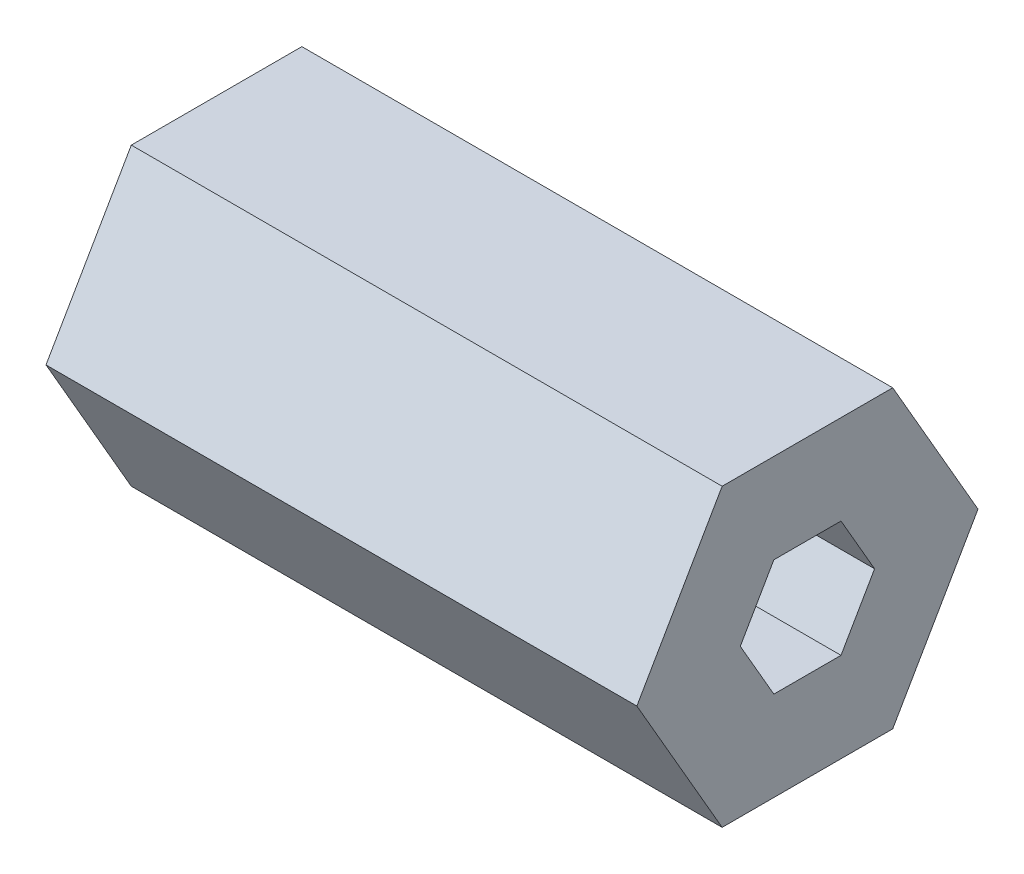
ISO-10303-21;
HEADER;
FILE_DESCRIPTION(('STEP AP214'),'2;1');
FILE_NAME('part.step','',(''),(''),'','','');
FILE_SCHEMA(('AUTOMOTIVE_DESIGN { 1 0 10303 214 1 1 1 1 }'));
ENDSEC;
DATA;
#1=APPLICATION_CONTEXT('core data for automotive mechanical design processes');
#2=APPLICATION_PROTOCOL_DEFINITION('international standard','automotive_design',2000,#1);
#3=PRODUCT_CONTEXT('',#1,'mechanical');
#4=PRODUCT('Part','Part','',(#3));
#5=PRODUCT_RELATED_PRODUCT_CATEGORY('part','',(#4));
#6=PRODUCT_DEFINITION_FORMATION('','',#4);
#7=PRODUCT_DEFINITION_CONTEXT('part definition',#1,'design');
#8=PRODUCT_DEFINITION('design','',#6,#7);
#9=PRODUCT_DEFINITION_SHAPE('','',#8);
#10=(LENGTH_UNIT() NAMED_UNIT(*) SI_UNIT(.MILLI.,.METRE.));
#11=(NAMED_UNIT(*) PLANE_ANGLE_UNIT() SI_UNIT($,.RADIAN.));
#12=(NAMED_UNIT(*) SI_UNIT($,.STERADIAN.) SOLID_ANGLE_UNIT());
#13=UNCERTAINTY_MEASURE_WITH_UNIT(LENGTH_MEASURE(1.E-05),#10,'distance_accuracy_value','');
#14=(GEOMETRIC_REPRESENTATION_CONTEXT(3) GLOBAL_UNCERTAINTY_ASSIGNED_CONTEXT((#13)) GLOBAL_UNIT_ASSIGNED_CONTEXT((#10,
#11,#12)) REPRESENTATION_CONTEXT('',''));
#15=CARTESIAN_POINT('',(0.,0.,0.));
#16=DIRECTION('',(0.,0.,1.));
#17=DIRECTION('',(1.,0.,0.));
#18=AXIS2_PLACEMENT_3D('',#15,#16,#17);
#19=CARTESIAN_POINT('',(12.7,0.,0.));
#20=DIRECTION('',(1.,0.,0.));
#21=DIRECTION('',(0.,0.,-1.));
#22=AXIS2_PLACEMENT_3D('',#19,#20,#21);
#23=PLANE('',#22);
#24=DIRECTION('',(0.,0.866025403784441,-0.499999999999995));
#25=VECTOR('',#24,1.);
#26=CARTESIAN_POINT('',(12.7,-6.34999999999996,-3.6661742093542));
#27=LINE('',#26,#25);
#28=CARTESIAN_POINT('',(12.7,-6.34999999999996,-3.6661742093542));
#29=VERTEX_POINT('',#28);
#30=CARTESIAN_POINT('',(12.7,0.,-7.33234841870825));
#31=VERTEX_POINT('',#30);
#32=EDGE_CURVE('E181',#29,#31,#27,.T.);
#33=ORIENTED_EDGE('',*,*,#32,.T.);
#34=DIRECTION('',(0.,0.866025403784438,0.500000000000001));
#35=VECTOR('',#34,1.);
#36=CARTESIAN_POINT('',(12.7,0.,-7.33234841870825));
#37=LINE('',#36,#35);
#38=CARTESIAN_POINT('',(12.7,6.35000000000001,-3.66617420935411));
#39=VERTEX_POINT('',#38);
#40=EDGE_CURVE('E184',#31,#39,#37,.T.);
#41=ORIENTED_EDGE('',*,*,#40,.T.);
#42=DIRECTION('',(0.,0.,1.));
#43=VECTOR('',#42,1.);
#44=CARTESIAN_POINT('',(12.7,6.35000000000001,-3.66617420935411));
#45=LINE('',#44,#43);
#46=CARTESIAN_POINT('',(12.7,6.34999999999999,3.66617420935416));
#47=VERTEX_POINT('',#46);
#48=EDGE_CURVE('E187',#39,#47,#45,.T.);
#49=ORIENTED_EDGE('',*,*,#48,.T.);
#50=DIRECTION('',(0.,-0.866025403784442,0.499999999999995));
#51=VECTOR('',#50,1.);
#52=CARTESIAN_POINT('',(12.7,6.34999999999999,3.66617420935416));
#53=LINE('',#52,#51);
#54=CARTESIAN_POINT('',(12.7,0.,7.33234841870825));
#55=VERTEX_POINT('',#54);
#56=EDGE_CURVE('E189',#47,#55,#53,.T.);
#57=ORIENTED_EDGE('',*,*,#56,.T.);
#58=DIRECTION('',(0.,-0.866025403784435,-0.500000000000007));
#59=VECTOR('',#58,1.);
#60=CARTESIAN_POINT('',(12.7,0.,7.33234841870825));
#61=LINE('',#60,#59);
#62=CARTESIAN_POINT('',(12.7,-6.35000000000004,3.66617420935407));
#63=VERTEX_POINT('',#62);
#64=EDGE_CURVE('E191',#55,#63,#61,.T.);
#65=ORIENTED_EDGE('',*,*,#64,.T.);
#66=DIRECTION('',(0.,0.,-1.));
#67=VECTOR('',#66,1.);
#68=CARTESIAN_POINT('',(12.7,-6.35000000000004,3.66617420935407));
#69=LINE('',#68,#67);
#70=EDGE_CURVE('E193',#63,#29,#69,.T.);
#71=ORIENTED_EDGE('',*,*,#70,.T.);
#72=EDGE_LOOP('',(#33,#41,#49,#57,#65,#71));
#73=FACE_BOUND('',#72,.T.);
#74=DIRECTION('',(0.,0.866025403784438,0.5));
#75=VECTOR('',#74,1.);
#76=CARTESIAN_POINT('',(12.7,0.,-2.88675134594813));
#77=LINE('',#76,#75);
#78=CARTESIAN_POINT('',(12.7,0.,-2.88675134594813));
#79=VERTEX_POINT('',#78);
#80=CARTESIAN_POINT('',(12.7,2.5,-1.44337567297406));
#81=VERTEX_POINT('',#80);
#82=EDGE_CURVE('E138',#79,#81,#77,.T.);
#83=ORIENTED_EDGE('',*,*,#82,.F.);
#84=DIRECTION('',(0.,0.866025403784439,-0.5));
#85=VECTOR('',#84,1.);
#86=CARTESIAN_POINT('',(12.7,-2.5,-1.44337567297407));
#87=LINE('',#86,#85);
#88=CARTESIAN_POINT('',(12.7,-2.5,-1.44337567297407));
#89=VERTEX_POINT('',#88);
#90=EDGE_CURVE('E130',#89,#79,#87,.T.);
#91=ORIENTED_EDGE('',*,*,#90,.F.);
#92=DIRECTION('',(0.,0.,-1.));
#93=VECTOR('',#92,1.);
#94=CARTESIAN_POINT('',(12.7,-2.5,1.44337567297406));
#95=LINE('',#94,#93);
#96=CARTESIAN_POINT('',(12.7,-2.5,1.44337567297406));
#97=VERTEX_POINT('',#96);
#98=EDGE_CURVE('E159',#97,#89,#95,.T.);
#99=ORIENTED_EDGE('',*,*,#98,.F.);
#100=DIRECTION('',(0.,-0.866025403784438,-0.5));
#101=VECTOR('',#100,1.);
#102=CARTESIAN_POINT('',(12.7,0.,2.88675134594813));
#103=LINE('',#102,#101);
#104=CARTESIAN_POINT('',(12.7,0.,2.88675134594813));
#105=VERTEX_POINT('',#104);
#106=EDGE_CURVE('E157',#105,#97,#103,.T.);
#107=ORIENTED_EDGE('',*,*,#106,.F.);
#108=DIRECTION('',(0.,-0.866025403784439,0.5));
#109=VECTOR('',#108,1.);
#110=CARTESIAN_POINT('',(12.7,2.5,1.44337567297406));
#111=LINE('',#110,#109);
#112=CARTESIAN_POINT('',(12.7,2.5,1.44337567297406));
#113=VERTEX_POINT('',#112);
#114=EDGE_CURVE('E153',#113,#105,#111,.T.);
#115=ORIENTED_EDGE('',*,*,#114,.F.);
#116=DIRECTION('',(0.,0.,1.));
#117=VECTOR('',#116,1.);
#118=CARTESIAN_POINT('',(12.7,2.5,-1.44337567297406));
#119=LINE('',#118,#117);
#120=EDGE_CURVE('E151',#81,#113,#119,.T.);
#121=ORIENTED_EDGE('',*,*,#120,.F.);
#122=EDGE_LOOP('',(#83,#91,#99,#107,#115,#121));
#123=FACE_BOUND('',#122,.T.);
#124=ADVANCED_FACE('F41',(#73,#123),#23,.T.);
#125=CARTESIAN_POINT('',(-12.7,0.,0.));
#126=DIRECTION('',(1.,0.,0.));
#127=DIRECTION('',(0.,0.,-1.));
#128=AXIS2_PLACEMENT_3D('',#125,#126,#127);
#129=PLANE('',#128);
#130=DIRECTION('',(0.,0.866025403784441,-0.499999999999995));
#131=VECTOR('',#130,1.);
#132=CARTESIAN_POINT('',(-12.7,-6.34999999999996,-3.6661742093542));
#133=LINE('',#132,#131);
#134=CARTESIAN_POINT('',(-12.7,-6.34999999999996,-3.6661742093542));
#135=VERTEX_POINT('',#134);
#136=CARTESIAN_POINT('',(-12.7,0.,-7.33234841870825));
#137=VERTEX_POINT('',#136);
#138=EDGE_CURVE('E146',#135,#137,#133,.T.);
#139=ORIENTED_EDGE('',*,*,#138,.F.);
#140=DIRECTION('',(0.,0.,-1.));
#141=VECTOR('',#140,1.);
#142=CARTESIAN_POINT('',(-12.7,-6.35000000000004,3.66617420935407));
#143=LINE('',#142,#141);
#144=CARTESIAN_POINT('',(-12.7,-6.35000000000004,3.66617420935407));
#145=VERTEX_POINT('',#144);
#146=EDGE_CURVE('E185',#145,#135,#143,.T.);
#147=ORIENTED_EDGE('',*,*,#146,.F.);
#148=DIRECTION('',(0.,-0.866025403784435,-0.500000000000007));
#149=VECTOR('',#148,1.);
#150=CARTESIAN_POINT('',(-12.7,0.,7.33234841870825));
#151=LINE('',#150,#149);
#152=CARTESIAN_POINT('',(-12.7,0.,7.33234841870825));
#153=VERTEX_POINT('',#152);
#154=EDGE_CURVE('E204',#153,#145,#151,.T.);
#155=ORIENTED_EDGE('',*,*,#154,.F.);
#156=DIRECTION('',(0.,-0.866025403784442,0.499999999999995));
#157=VECTOR('',#156,1.);
#158=CARTESIAN_POINT('',(-12.7,6.34999999999999,3.66617420935416));
#159=LINE('',#158,#157);
#160=CARTESIAN_POINT('',(-12.7,6.34999999999999,3.66617420935416));
#161=VERTEX_POINT('',#160);
#162=EDGE_CURVE('E202',#161,#153,#159,.T.);
#163=ORIENTED_EDGE('',*,*,#162,.F.);
#164=DIRECTION('',(0.,0.,1.));
#165=VECTOR('',#164,1.);
#166=CARTESIAN_POINT('',(-12.7,6.35000000000001,-3.66617420935411));
#167=LINE('',#166,#165);
#168=CARTESIAN_POINT('',(-12.7,6.35000000000001,-3.66617420935411));
#169=VERTEX_POINT('',#168);
#170=EDGE_CURVE('E200',#169,#161,#167,.T.);
#171=ORIENTED_EDGE('',*,*,#170,.F.);
#172=DIRECTION('',(0.,0.866025403784438,0.500000000000001));
#173=VECTOR('',#172,1.);
#174=CARTESIAN_POINT('',(-12.7,0.,-7.33234841870825));
#175=LINE('',#174,#173);
#176=EDGE_CURVE('E198',#137,#169,#175,.T.);
#177=ORIENTED_EDGE('',*,*,#176,.F.);
#178=EDGE_LOOP('',(#139,#147,#155,#163,#171,#177));
#179=FACE_BOUND('',#178,.T.);
#180=DIRECTION('',(0.,0.866025403784439,-0.5));
#181=VECTOR('',#180,1.);
#182=CARTESIAN_POINT('',(-12.7,-2.5,-1.44337567297407));
#183=LINE('',#182,#181);
#184=CARTESIAN_POINT('',(-12.7,-2.5,-1.44337567297407));
#185=VERTEX_POINT('',#184);
#186=CARTESIAN_POINT('',(-12.7,0.,-2.88675134594813));
#187=VERTEX_POINT('',#186);
#188=EDGE_CURVE('E64',#185,#187,#183,.T.);
#189=ORIENTED_EDGE('',*,*,#188,.T.);
#190=DIRECTION('',(0.,0.866025403784438,0.5));
#191=VECTOR('',#190,1.);
#192=CARTESIAN_POINT('',(-12.7,0.,-2.88675134594813));
#193=LINE('',#192,#191);
#194=CARTESIAN_POINT('',(-12.7,2.5,-1.44337567297406));
#195=VERTEX_POINT('',#194);
#196=EDGE_CURVE('E145',#187,#195,#193,.T.);
#197=ORIENTED_EDGE('',*,*,#196,.T.);
#198=DIRECTION('',(0.,0.,1.));
#199=VECTOR('',#198,1.);
#200=CARTESIAN_POINT('',(-12.7,2.5,-1.44337567297406));
#201=LINE('',#200,#199);
#202=CARTESIAN_POINT('',(-12.7,2.5,1.44337567297406));
#203=VERTEX_POINT('',#202);
#204=EDGE_CURVE('E163',#195,#203,#201,.T.);
#205=ORIENTED_EDGE('',*,*,#204,.T.);
#206=DIRECTION('',(0.,-0.866025403784439,0.5));
#207=VECTOR('',#206,1.);
#208=CARTESIAN_POINT('',(-12.7,2.5,1.44337567297406));
#209=LINE('',#208,#207);
#210=CARTESIAN_POINT('',(-12.7,0.,2.88675134594813));
#211=VERTEX_POINT('',#210);
#212=EDGE_CURVE('E166',#203,#211,#209,.T.);
#213=ORIENTED_EDGE('',*,*,#212,.T.);
#214=DIRECTION('',(0.,-0.866025403784438,-0.5));
#215=VECTOR('',#214,1.);
#216=CARTESIAN_POINT('',(-12.7,0.,2.88675134594813));
#217=LINE('',#216,#215);
#218=CARTESIAN_POINT('',(-12.7,-2.5,1.44337567297406));
#219=VERTEX_POINT('',#218);
#220=EDGE_CURVE('E169',#211,#219,#217,.T.);
#221=ORIENTED_EDGE('',*,*,#220,.T.);
#222=DIRECTION('',(0.,0.,-1.));
#223=VECTOR('',#222,1.);
#224=CARTESIAN_POINT('',(-12.7,-2.5,1.44337567297406));
#225=LINE('',#224,#223);
#226=EDGE_CURVE('E139',#219,#185,#225,.T.);
#227=ORIENTED_EDGE('',*,*,#226,.T.);
#228=EDGE_LOOP('',(#189,#197,#205,#213,#221,#227));
#229=FACE_BOUND('',#228,.T.);
#230=ADVANCED_FACE('F228',(#179,#229),#129,.F.);
#231=CARTESIAN_POINT('',(12.7,-6.34999999999996,-3.6661742093542));
#232=DIRECTION('',(0.,0.499999999999995,0.866025403784441));
#233=DIRECTION('',(0.,-0.866025403784441,0.499999999999995));
#234=AXIS2_PLACEMENT_3D('',#231,#232,#233);
#235=PLANE('',#234);
#236=ORIENTED_EDGE('',*,*,#138,.T.);
#237=DIRECTION('',(-1.,0.,0.));
#238=VECTOR('',#237,1.);
#239=CARTESIAN_POINT('',(12.7,0.,-7.33234841870825));
#240=LINE('',#239,#238);
#241=EDGE_CURVE('E11',#31,#137,#240,.T.);
#242=ORIENTED_EDGE('',*,*,#241,.F.);
#243=ORIENTED_EDGE('',*,*,#32,.F.);
#244=DIRECTION('',(-1.,0.,0.));
#245=VECTOR('',#244,1.);
#246=CARTESIAN_POINT('',(12.7,-6.34999999999996,-3.6661742093542));
#247=LINE('',#246,#245);
#248=EDGE_CURVE('E195',#29,#135,#247,.T.);
#249=ORIENTED_EDGE('',*,*,#248,.T.);
#250=EDGE_LOOP('',(#236,#242,#243,#249));
#251=FACE_BOUND('',#250,.T.);
#252=ADVANCED_FACE('F43',(#251),#235,.F.);
#253=CARTESIAN_POINT('',(12.7,0.,-7.33234841870825));
#254=DIRECTION('',(0.,-0.500000000000001,0.866025403784438));
#255=DIRECTION('',(0.,-0.866025403784438,-0.500000000000001));
#256=AXIS2_PLACEMENT_3D('',#253,#254,#255);
#257=PLANE('',#256);
#258=ORIENTED_EDGE('',*,*,#176,.T.);
#259=DIRECTION('',(-1.,0.,0.));
#260=VECTOR('',#259,1.);
#261=CARTESIAN_POINT('',(12.7,6.35000000000001,-3.66617420935411));
#262=LINE('',#261,#260);
#263=EDGE_CURVE('E49',#39,#169,#262,.T.);
#264=ORIENTED_EDGE('',*,*,#263,.F.);
#265=ORIENTED_EDGE('',*,*,#40,.F.);
#266=ORIENTED_EDGE('',*,*,#241,.T.);
#267=EDGE_LOOP('',(#258,#264,#265,#266));
#268=FACE_BOUND('',#267,.T.);
#269=ADVANCED_FACE('F245',(#268),#257,.F.);
#270=CARTESIAN_POINT('',(12.7,6.35000000000001,-3.66617420935411));
#271=DIRECTION('',(0.,-1.,0.));
#272=DIRECTION('',(0.,0.,-1.));
#273=AXIS2_PLACEMENT_3D('',#270,#271,#272);
#274=PLANE('',#273);
#275=ORIENTED_EDGE('',*,*,#170,.T.);
#276=DIRECTION('',(-1.,0.,0.));
#277=VECTOR('',#276,1.);
#278=CARTESIAN_POINT('',(12.7,6.34999999999999,3.66617420935416));
#279=LINE('',#278,#277);
#280=EDGE_CURVE('E215',#47,#161,#279,.T.);
#281=ORIENTED_EDGE('',*,*,#280,.F.);
#282=ORIENTED_EDGE('',*,*,#48,.F.);
#283=ORIENTED_EDGE('',*,*,#263,.T.);
#284=EDGE_LOOP('',(#275,#281,#282,#283));
#285=FACE_BOUND('',#284,.T.);
#286=ADVANCED_FACE('F222',(#285),#274,.F.);
#287=CARTESIAN_POINT('',(12.7,6.34999999999999,3.66617420935416));
#288=DIRECTION('',(0.,-0.499999999999995,-0.866025403784442));
#289=DIRECTION('',(0.,0.866025403784442,-0.499999999999995));
#290=AXIS2_PLACEMENT_3D('',#287,#288,#289);
#291=PLANE('',#290);
#292=ORIENTED_EDGE('',*,*,#162,.T.);
#293=DIRECTION('',(-1.,0.,0.));
#294=VECTOR('',#293,1.);
#295=CARTESIAN_POINT('',(12.7,0.,7.33234841870825));
#296=LINE('',#295,#294);
#297=EDGE_CURVE('E212',#55,#153,#296,.T.);
#298=ORIENTED_EDGE('',*,*,#297,.F.);
#299=ORIENTED_EDGE('',*,*,#56,.F.);
#300=ORIENTED_EDGE('',*,*,#280,.T.);
#301=EDGE_LOOP('',(#292,#298,#299,#300));
#302=FACE_BOUND('',#301,.T.);
#303=ADVANCED_FACE('F234',(#302),#291,.F.);
#304=CARTESIAN_POINT('',(12.7,0.,7.33234841870825));
#305=DIRECTION('',(0.,0.500000000000007,-0.866025403784435));
#306=DIRECTION('',(0.,0.866025403784435,0.500000000000007));
#307=AXIS2_PLACEMENT_3D('',#304,#305,#306);
#308=PLANE('',#307);
#309=ORIENTED_EDGE('',*,*,#154,.T.);
#310=DIRECTION('',(-1.,0.,0.));
#311=VECTOR('',#310,1.);
#312=CARTESIAN_POINT('',(12.7,-6.35000000000004,3.66617420935407));
#313=LINE('',#312,#311);
#314=EDGE_CURVE('E209',#63,#145,#313,.T.);
#315=ORIENTED_EDGE('',*,*,#314,.F.);
#316=ORIENTED_EDGE('',*,*,#64,.F.);
#317=ORIENTED_EDGE('',*,*,#297,.T.);
#318=EDGE_LOOP('',(#309,#315,#316,#317));
#319=FACE_BOUND('',#318,.T.);
#320=ADVANCED_FACE('F238',(#319),#308,.F.);
#321=CARTESIAN_POINT('',(12.7,-6.35000000000004,3.66617420935407));
#322=DIRECTION('',(0.,1.,0.));
#323=DIRECTION('',(0.,0.,1.));
#324=AXIS2_PLACEMENT_3D('',#321,#322,#323);
#325=PLANE('',#324);
#326=ORIENTED_EDGE('',*,*,#146,.T.);
#327=ORIENTED_EDGE('',*,*,#248,.F.);
#328=ORIENTED_EDGE('',*,*,#70,.F.);
#329=ORIENTED_EDGE('',*,*,#314,.T.);
#330=EDGE_LOOP('',(#326,#327,#328,#329));
#331=FACE_BOUND('',#330,.T.);
#332=ADVANCED_FACE('F248',(#331),#325,.F.);
#333=CARTESIAN_POINT('',(12.7,-2.5,-1.44337567297407));
#334=DIRECTION('',(0.,0.5,0.866025403784439));
#335=DIRECTION('',(0.,-0.866025403784439,0.5));
#336=AXIS2_PLACEMENT_3D('',#333,#334,#335);
#337=PLANE('',#336);
#338=ORIENTED_EDGE('',*,*,#188,.F.);
#339=DIRECTION('',(-1.,0.,0.));
#340=VECTOR('',#339,1.);
#341=CARTESIAN_POINT('',(12.7,-2.5,-1.44337567297407));
#342=LINE('',#341,#340);
#343=EDGE_CURVE('E134',#89,#185,#342,.T.);
#344=ORIENTED_EDGE('',*,*,#343,.F.);
#345=ORIENTED_EDGE('',*,*,#90,.T.);
#346=DIRECTION('',(-1.,0.,0.));
#347=VECTOR('',#346,1.);
#348=CARTESIAN_POINT('',(12.7,0.,-2.88675134594813));
#349=LINE('',#348,#347);
#350=EDGE_CURVE('E133',#79,#187,#349,.T.);
#351=ORIENTED_EDGE('',*,*,#350,.T.);
#352=EDGE_LOOP('',(#338,#344,#345,#351));
#353=FACE_BOUND('',#352,.T.);
#354=ADVANCED_FACE('F132',(#353),#337,.T.);
#355=CARTESIAN_POINT('',(12.7,0.,-2.88675134594813));
#356=DIRECTION('',(0.,-0.5,0.866025403784439));
#357=DIRECTION('',(0.,-0.866025403784439,-0.5));
#358=AXIS2_PLACEMENT_3D('',#355,#356,#357);
#359=PLANE('',#358);
#360=ORIENTED_EDGE('',*,*,#196,.F.);
#361=ORIENTED_EDGE('',*,*,#350,.F.);
#362=ORIENTED_EDGE('',*,*,#82,.T.);
#363=DIRECTION('',(-1.,0.,0.));
#364=VECTOR('',#363,1.);
#365=CARTESIAN_POINT('',(12.7,2.5,-1.44337567297406));
#366=LINE('',#365,#364);
#367=EDGE_CURVE('E147',#81,#195,#366,.T.);
#368=ORIENTED_EDGE('',*,*,#367,.T.);
#369=EDGE_LOOP('',(#360,#361,#362,#368));
#370=FACE_BOUND('',#369,.T.);
#371=ADVANCED_FACE('F142',(#370),#359,.T.);
#372=CARTESIAN_POINT('',(12.7,2.5,-1.44337567297406));
#373=DIRECTION('',(0.,-1.,0.));
#374=DIRECTION('',(0.,0.,-1.));
#375=AXIS2_PLACEMENT_3D('',#372,#373,#374);
#376=PLANE('',#375);
#377=ORIENTED_EDGE('',*,*,#204,.F.);
#378=ORIENTED_EDGE('',*,*,#367,.F.);
#379=ORIENTED_EDGE('',*,*,#120,.T.);
#380=DIRECTION('',(-1.,0.,0.));
#381=VECTOR('',#380,1.);
#382=CARTESIAN_POINT('',(12.7,2.5,1.44337567297406));
#383=LINE('',#382,#381);
#384=EDGE_CURVE('E178',#113,#203,#383,.T.);
#385=ORIENTED_EDGE('',*,*,#384,.T.);
#386=EDGE_LOOP('',(#377,#378,#379,#385));
#387=FACE_BOUND('',#386,.T.);
#388=ADVANCED_FACE('F266',(#387),#376,.T.);
#389=CARTESIAN_POINT('',(12.7,2.5,1.44337567297406));
#390=DIRECTION('',(0.,-0.5,-0.866025403784439));
#391=DIRECTION('',(0.,0.866025403784439,-0.5));
#392=AXIS2_PLACEMENT_3D('',#389,#390,#391);
#393=PLANE('',#392);
#394=ORIENTED_EDGE('',*,*,#212,.F.);
#395=ORIENTED_EDGE('',*,*,#384,.F.);
#396=ORIENTED_EDGE('',*,*,#114,.T.);
#397=DIRECTION('',(-1.,0.,0.));
#398=VECTOR('',#397,1.);
#399=CARTESIAN_POINT('',(12.7,0.,2.88675134594813));
#400=LINE('',#399,#398);
#401=EDGE_CURVE('E176',#105,#211,#400,.T.);
#402=ORIENTED_EDGE('',*,*,#401,.T.);
#403=EDGE_LOOP('',(#394,#395,#396,#402));
#404=FACE_BOUND('',#403,.T.);
#405=ADVANCED_FACE('F269',(#404),#393,.T.);
#406=CARTESIAN_POINT('',(12.7,0.,2.88675134594813));
#407=DIRECTION('',(0.,0.5,-0.866025403784438));
#408=DIRECTION('',(0.,0.866025403784439,0.5));
#409=AXIS2_PLACEMENT_3D('',#406,#407,#408);
#410=PLANE('',#409);
#411=ORIENTED_EDGE('',*,*,#220,.F.);
#412=ORIENTED_EDGE('',*,*,#401,.F.);
#413=ORIENTED_EDGE('',*,*,#106,.T.);
#414=DIRECTION('',(-1.,0.,0.));
#415=VECTOR('',#414,1.);
#416=CARTESIAN_POINT('',(12.7,-2.5,1.44337567297406));
#417=LINE('',#416,#415);
#418=EDGE_CURVE('E56',#97,#219,#417,.T.);
#419=ORIENTED_EDGE('',*,*,#418,.T.);
#420=EDGE_LOOP('',(#411,#412,#413,#419));
#421=FACE_BOUND('',#420,.T.);
#422=ADVANCED_FACE('F273',(#421),#410,.T.);
#423=CARTESIAN_POINT('',(12.7,-2.5,1.44337567297406));
#424=DIRECTION('',(0.,1.,0.));
#425=DIRECTION('',(0.,0.,1.));
#426=AXIS2_PLACEMENT_3D('',#423,#424,#425);
#427=PLANE('',#426);
#428=ORIENTED_EDGE('',*,*,#226,.F.);
#429=ORIENTED_EDGE('',*,*,#418,.F.);
#430=ORIENTED_EDGE('',*,*,#98,.T.);
#431=ORIENTED_EDGE('',*,*,#343,.T.);
#432=EDGE_LOOP('',(#428,#429,#430,#431));
#433=FACE_BOUND('',#432,.T.);
#434=ADVANCED_FACE('F277',(#433),#427,.T.);
#435=CLOSED_SHELL('',(#124,#230,#252,#269,#286,#303,#320,#332,#354,#371,#388,#405,#422,#434));
#436=MANIFOLD_SOLID_BREP('B2',#435);
#437=ADVANCED_BREP_SHAPE_REPRESENTATION('',(#18,#436),#14);
#438=SHAPE_DEFINITION_REPRESENTATION(#9,#437);
ENDSEC;
END-ISO-10303-21;
